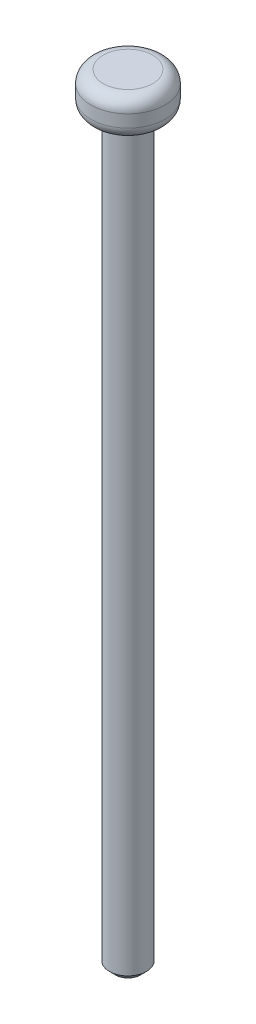
ISO-10303-21;
HEADER;
FILE_DESCRIPTION(('STEP AP214'),'2;1');
FILE_NAME('part.step','',(''),(''),'','','');
FILE_SCHEMA(('AUTOMOTIVE_DESIGN { 1 0 10303 214 1 1 1 1 }'));
ENDSEC;
DATA;
#1=APPLICATION_CONTEXT('core data for automotive mechanical design processes');
#2=APPLICATION_PROTOCOL_DEFINITION('international standard','automotive_design',2000,#1);
#3=PRODUCT_CONTEXT('',#1,'mechanical');
#4=PRODUCT('Part','Part','',(#3));
#5=PRODUCT_RELATED_PRODUCT_CATEGORY('part','',(#4));
#6=PRODUCT_DEFINITION_FORMATION('','',#4);
#7=PRODUCT_DEFINITION_CONTEXT('part definition',#1,'design');
#8=PRODUCT_DEFINITION('design','',#6,#7);
#9=PRODUCT_DEFINITION_SHAPE('','',#8);
#10=(LENGTH_UNIT() NAMED_UNIT(*) SI_UNIT(.MILLI.,.METRE.));
#11=(NAMED_UNIT(*) PLANE_ANGLE_UNIT() SI_UNIT($,.RADIAN.));
#12=(NAMED_UNIT(*) SI_UNIT($,.STERADIAN.) SOLID_ANGLE_UNIT());
#13=UNCERTAINTY_MEASURE_WITH_UNIT(LENGTH_MEASURE(1.E-05),#10,'distance_accuracy_value','');
#14=(GEOMETRIC_REPRESENTATION_CONTEXT(3) GLOBAL_UNCERTAINTY_ASSIGNED_CONTEXT((#13)) GLOBAL_UNIT_ASSIGNED_CONTEXT((#10,
#11,#12)) REPRESENTATION_CONTEXT('',''));
#15=CARTESIAN_POINT('',(0.,0.,0.));
#16=DIRECTION('',(0.,0.,1.));
#17=DIRECTION('',(1.,0.,0.));
#18=AXIS2_PLACEMENT_3D('',#15,#16,#17);
#19=CARTESIAN_POINT('',(0.,0.,0.));
#20=DIRECTION('',(0.,1.,0.));
#21=DIRECTION('',(-1.,0.,0.));
#22=AXIS2_PLACEMENT_3D('',#19,#20,#21);
#23=PLANE('',#22);
#24=CARTESIAN_POINT('',(0.,0.,0.));
#25=DIRECTION('',(0.,1.,0.));
#26=DIRECTION('',(-1.,0.,0.));
#27=AXIS2_PLACEMENT_3D('',#24,#25,#26);
#28=CIRCLE('',#27,0.0999999999999968);
#29=CARTESIAN_POINT('',(-0.0999999999999968,0.,0.));
#30=VERTEX_POINT('',#29);
#31=EDGE_CURVE('E10',#30,#30,#28,.F.);
#32=ORIENTED_EDGE('',*,*,#31,.T.);
#33=EDGE_LOOP('',(#32));
#34=FACE_BOUND('',#33,.T.);
#35=ADVANCED_FACE('F45',(#34),#23,.F.);
#36=CARTESIAN_POINT('',(0.,6.30000000000001,0.));
#37=DIRECTION('',(0.,1.,0.));
#38=DIRECTION('',(-1.,0.,0.));
#39=AXIS2_PLACEMENT_3D('',#36,#37,#38);
#40=CYLINDRICAL_SURFACE('',#39,0.15);
#41=CARTESIAN_POINT('',(0.,0.0500000000000023,0.));
#42=DIRECTION('',(0.,1.,0.));
#43=DIRECTION('',(-1.,0.,0.));
#44=AXIS2_PLACEMENT_3D('',#41,#42,#43);
#45=CIRCLE('',#44,0.15);
#46=CARTESIAN_POINT('',(-0.15,0.0500000000000023,0.));
#47=VERTEX_POINT('',#46);
#48=EDGE_CURVE('E54',#47,#47,#45,.T.);
#49=ORIENTED_EDGE('',*,*,#48,.T.);
#50=EDGE_LOOP('',(#49));
#51=FACE_BOUND('',#50,.T.);
#52=CARTESIAN_POINT('',(0.,6.00000000000001,0.));
#53=DIRECTION('',(0.,1.,0.));
#54=DIRECTION('',(-1.,0.,0.));
#55=AXIS2_PLACEMENT_3D('',#52,#53,#54);
#56=CIRCLE('',#55,0.149999999999999);
#57=CARTESIAN_POINT('',(-0.149999999999999,6.00000000000001,0.));
#58=VERTEX_POINT('',#57);
#59=EDGE_CURVE('E78',#58,#58,#56,.T.);
#60=ORIENTED_EDGE('',*,*,#59,.F.);
#61=EDGE_LOOP('',(#60));
#62=FACE_BOUND('',#61,.T.);
#63=ADVANCED_FACE('F85',(#51,#62),#40,.T.);
#64=CARTESIAN_POINT('',(0.15,6.00000000000001,0.));
#65=DIRECTION('',(0.,1.,0.));
#66=DIRECTION('',(-1.,0.,0.));
#67=AXIS2_PLACEMENT_3D('',#64,#65,#66);
#68=PLANE('',#67);
#69=CARTESIAN_POINT('',(0.,6.00000000000001,0.));
#70=DIRECTION('',(0.,1.,0.));
#71=DIRECTION('',(-1.,0.,0.));
#72=AXIS2_PLACEMENT_3D('',#69,#70,#71);
#73=CIRCLE('',#72,0.199999999999999);
#74=CARTESIAN_POINT('',(-0.199999999999999,6.00000000000001,0.));
#75=VERTEX_POINT('',#74);
#76=EDGE_CURVE('E64',#75,#75,#73,.F.);
#77=ORIENTED_EDGE('',*,*,#76,.T.);
#78=EDGE_LOOP('',(#77));
#79=FACE_BOUND('',#78,.T.);
#80=ORIENTED_EDGE('',*,*,#59,.T.);
#81=EDGE_LOOP('',(#80));
#82=FACE_BOUND('',#81,.T.);
#83=ADVANCED_FACE('F83',(#79,#82),#68,.F.);
#84=CARTESIAN_POINT('',(0.,6.30000000000001,0.));
#85=DIRECTION('',(0.,1.,0.));
#86=DIRECTION('',(-1.,0.,0.));
#87=AXIS2_PLACEMENT_3D('',#84,#85,#86);
#88=CYLINDRICAL_SURFACE('',#87,0.299999999999999);
#89=CARTESIAN_POINT('',(0.,6.10000000000001,0.));
#90=DIRECTION('',(0.,1.,0.));
#91=DIRECTION('',(-1.,0.,0.));
#92=AXIS2_PLACEMENT_3D('',#89,#90,#91);
#93=CIRCLE('',#92,0.299999999999999);
#94=CARTESIAN_POINT('',(-0.299999999999999,6.10000000000001,0.));
#95=VERTEX_POINT('',#94);
#96=EDGE_CURVE('E70',#95,#95,#93,.T.);
#97=ORIENTED_EDGE('',*,*,#96,.T.);
#98=EDGE_LOOP('',(#97));
#99=FACE_BOUND('',#98,.T.);
#100=CARTESIAN_POINT('',(0.,6.20000000000001,0.));
#101=DIRECTION('',(0.,-1.,0.));
#102=DIRECTION('',(1.,0.,0.));
#103=AXIS2_PLACEMENT_3D('',#100,#101,#102);
#104=CIRCLE('',#103,0.299999999999999);
#105=CARTESIAN_POINT('',(0.3,6.20000000000001,0.));
#106=VERTEX_POINT('',#105);
#107=EDGE_CURVE('E74',#106,#106,#104,.T.);
#108=ORIENTED_EDGE('',*,*,#107,.T.);
#109=EDGE_LOOP('',(#108));
#110=FACE_BOUND('',#109,.T.);
#111=ADVANCED_FACE('F93',(#99,#110),#88,.T.);
#112=CARTESIAN_POINT('',(0.3,6.30000000000001,0.));
#113=DIRECTION('',(0.,-1.,0.));
#114=DIRECTION('',(1.,0.,0.));
#115=AXIS2_PLACEMENT_3D('',#112,#113,#114);
#116=PLANE('',#115);
#117=CARTESIAN_POINT('',(0.,6.30000000000001,0.));
#118=DIRECTION('',(0.,-1.,0.));
#119=DIRECTION('',(1.,0.,0.));
#120=AXIS2_PLACEMENT_3D('',#117,#118,#119);
#121=CIRCLE('',#120,0.199999999999999);
#122=CARTESIAN_POINT('',(0.2,6.30000000000001,0.));
#123=VERTEX_POINT('',#122);
#124=EDGE_CURVE('E59',#123,#123,#121,.F.);
#125=ORIENTED_EDGE('',*,*,#124,.T.);
#126=EDGE_LOOP('',(#125));
#127=FACE_BOUND('',#126,.T.);
#128=ADVANCED_FACE('F102',(#127),#116,.F.);
#129=CARTESIAN_POINT('',(0.,6.10000000000001,0.));
#130=DIRECTION('',(0.,1.,0.));
#131=DIRECTION('',(-1.,0.,0.));
#132=AXIS2_PLACEMENT_3D('',#129,#130,#131);
#133=TOROIDAL_SURFACE('',#132,0.199999999999999,0.1);
#134=ORIENTED_EDGE('',*,*,#76,.F.);
#135=EDGE_LOOP('',(#134));
#136=FACE_BOUND('',#135,.T.);
#137=ORIENTED_EDGE('',*,*,#96,.F.);
#138=EDGE_LOOP('',(#137));
#139=FACE_BOUND('',#138,.T.);
#140=ADVANCED_FACE('F99',(#136,#139),#133,.T.);
#141=CARTESIAN_POINT('',(0.,6.20000000000001,0.));
#142=DIRECTION('',(0.,-1.,0.));
#143=DIRECTION('',(1.,0.,0.));
#144=AXIS2_PLACEMENT_3D('',#141,#142,#143);
#145=TOROIDAL_SURFACE('',#144,0.199999999999999,0.1);
#146=ORIENTED_EDGE('',*,*,#107,.F.);
#147=EDGE_LOOP('',(#146));
#148=FACE_BOUND('',#147,.T.);
#149=ORIENTED_EDGE('',*,*,#124,.F.);
#150=EDGE_LOOP('',(#149));
#151=FACE_BOUND('',#150,.T.);
#152=ADVANCED_FACE('F101',(#148,#151),#145,.T.);
#153=CARTESIAN_POINT('',(0.,0.0500000000000023,0.));
#154=DIRECTION('',(0.,1.,0.));
#155=DIRECTION('',(-1.,0.,0.));
#156=AXIS2_PLACEMENT_3D('',#153,#154,#155);
#157=CONICAL_SURFACE('',#156,0.15,0.785398163397455);
#158=ORIENTED_EDGE('',*,*,#31,.F.);
#159=EDGE_LOOP('',(#158));
#160=FACE_BOUND('',#159,.T.);
#161=ORIENTED_EDGE('',*,*,#48,.F.);
#162=EDGE_LOOP('',(#161));
#163=FACE_BOUND('',#162,.T.);
#164=ADVANCED_FACE('F48',(#160,#163),#157,.T.);
#165=CLOSED_SHELL('',(#35,#63,#83,#111,#128,#140,#152,#164));
#166=MANIFOLD_SOLID_BREP('B2',#165);
#167=ADVANCED_BREP_SHAPE_REPRESENTATION('',(#18,#166),#14);
#168=SHAPE_DEFINITION_REPRESENTATION(#9,#167);
ENDSEC;
END-ISO-10303-21;
